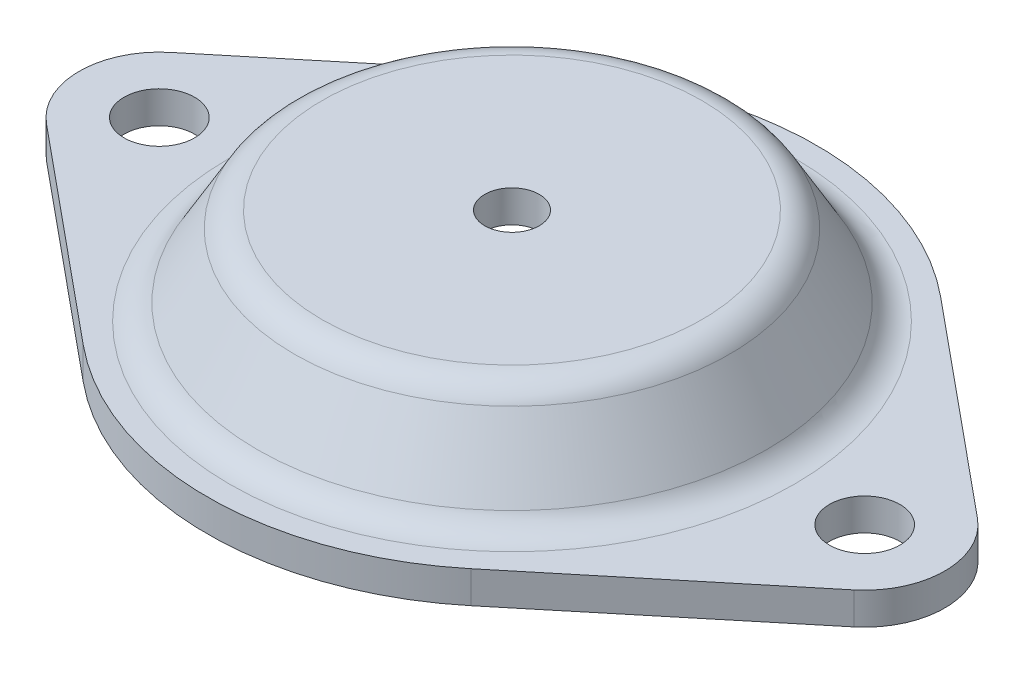
ISO-10303-21;
HEADER;
FILE_DESCRIPTION(('STEP AP214'),'2;1');
FILE_NAME('part.step','',(''),(''),'','','');
FILE_SCHEMA(('AUTOMOTIVE_DESIGN { 1 0 10303 214 1 1 1 1 }'));
ENDSEC;
DATA;
#1=APPLICATION_CONTEXT('core data for automotive mechanical design processes');
#2=APPLICATION_PROTOCOL_DEFINITION('international standard','automotive_design',2000,#1);
#3=PRODUCT_CONTEXT('',#1,'mechanical');
#4=PRODUCT('Part','Part','',(#3));
#5=PRODUCT_RELATED_PRODUCT_CATEGORY('part','',(#4));
#6=PRODUCT_DEFINITION_FORMATION('','',#4);
#7=PRODUCT_DEFINITION_CONTEXT('part definition',#1,'design');
#8=PRODUCT_DEFINITION('design','',#6,#7);
#9=PRODUCT_DEFINITION_SHAPE('','',#8);
#10=(LENGTH_UNIT() NAMED_UNIT(*) SI_UNIT(.MILLI.,.METRE.));
#11=(NAMED_UNIT(*) PLANE_ANGLE_UNIT() SI_UNIT($,.RADIAN.));
#12=(NAMED_UNIT(*) SI_UNIT($,.STERADIAN.) SOLID_ANGLE_UNIT());
#13=UNCERTAINTY_MEASURE_WITH_UNIT(LENGTH_MEASURE(1.E-05),#10,'distance_accuracy_value','');
#14=(GEOMETRIC_REPRESENTATION_CONTEXT(3) GLOBAL_UNCERTAINTY_ASSIGNED_CONTEXT((#13)) GLOBAL_UNIT_ASSIGNED_CONTEXT((#10,
#11,#12)) REPRESENTATION_CONTEXT('',''));
#15=CARTESIAN_POINT('',(0.,0.,0.));
#16=DIRECTION('',(0.,0.,1.));
#17=DIRECTION('',(1.,0.,0.));
#18=AXIS2_PLACEMENT_3D('',#15,#16,#17);
#19=CARTESIAN_POINT('',(-41.1602540378443,-15.,0.));
#20=DIRECTION('',(0.,1.,0.));
#21=DIRECTION('',(0.,0.,1.));
#22=AXIS2_PLACEMENT_3D('',#19,#20,#21);
#23=PLANE('',#22);
#24=CARTESIAN_POINT('',(55.,-15.,0.));
#25=DIRECTION('',(0.,1.,0.));
#26=DIRECTION('',(0.,0.,1.));
#27=AXIS2_PLACEMENT_3D('',#24,#25,#26);
#28=CIRCLE('',#27,5.5);
#29=CARTESIAN_POINT('',(55.,-15.,5.5));
#30=VERTEX_POINT('',#29);
#31=EDGE_CURVE('E176',#30,#30,#28,.T.);
#32=ORIENTED_EDGE('',*,*,#31,.F.);
#33=EDGE_LOOP('',(#32));
#34=FACE_BOUND('',#33,.T.);
#35=CARTESIAN_POINT('',(-55.,-15.,0.));
#36=DIRECTION('',(0.,1.,0.));
#37=DIRECTION('',(0.,0.,1.));
#38=AXIS2_PLACEMENT_3D('',#35,#36,#37);
#39=CIRCLE('',#38,5.5);
#40=CARTESIAN_POINT('',(-55.,-15.,5.5));
#41=VERTEX_POINT('',#40);
#42=EDGE_CURVE('E182',#41,#41,#39,.T.);
#43=ORIENTED_EDGE('',*,*,#42,.F.);
#44=EDGE_LOOP('',(#43));
#45=FACE_BOUND('',#44,.T.);
#46=CARTESIAN_POINT('',(0.,-15.,0.));
#47=DIRECTION('',(0.,1.,0.));
#48=DIRECTION('',(0.,0.,1.));
#49=AXIS2_PLACEMENT_3D('',#46,#47,#48);
#50=CIRCLE('',#49,44.0470053837925);
#51=CARTESIAN_POINT('',(0.,-15.,44.0470053837925));
#52=VERTEX_POINT('',#51);
#53=EDGE_CURVE('E203',#52,#52,#50,.F.);
#54=ORIENTED_EDGE('',*,*,#53,.T.);
#55=EDGE_LOOP('',(#54));
#56=FACE_BOUND('',#55,.T.);
#57=CARTESIAN_POINT('',(0.,-15.,0.));
#58=DIRECTION('',(0.,1.,0.));
#59=DIRECTION('',(0.,0.,1.));
#60=AXIS2_PLACEMENT_3D('',#57,#58,#59);
#61=CIRCLE('',#60,47.5);
#62=CARTESIAN_POINT('',(-30.2272727272727,-15.,36.6409877523938));
#63=VERTEX_POINT('',#62);
#64=CARTESIAN_POINT('',(30.2272727272727,-15.,36.6409877523938));
#65=VERTEX_POINT('',#64);
#66=EDGE_CURVE('E161',#63,#65,#61,.T.);
#67=ORIENTED_EDGE('',*,*,#66,.T.);
#68=DIRECTION('',(0.77138921583987,0.,-0.636363636363637));
#69=VECTOR('',#68,1.);
#70=CARTESIAN_POINT('',(5.73522073781167,-15.,56.8458998071355));
#71=LINE('',#70,#69);
#72=CARTESIAN_POINT('',(62.9545454545455,-15.,9.64236519799837));
#73=VERTEX_POINT('',#72);
#74=EDGE_CURVE('E164',#65,#73,#71,.T.);
#75=ORIENTED_EDGE('',*,*,#74,.T.);
#76=CARTESIAN_POINT('',(55.,-15.,0.));
#77=DIRECTION('',(0.,1.,0.));
#78=DIRECTION('',(0.,0.,1.));
#79=AXIS2_PLACEMENT_3D('',#76,#77,#78);
#80=CIRCLE('',#79,12.5);
#81=CARTESIAN_POINT('',(62.9545454545455,-15.,-9.64236519799837));
#82=VERTEX_POINT('',#81);
#83=EDGE_CURVE('E167',#73,#82,#80,.T.);
#84=ORIENTED_EDGE('',*,*,#83,.T.);
#85=DIRECTION('',(-0.77138921583987,0.,-0.636363636363637));
#86=VECTOR('',#85,1.);
#87=CARTESIAN_POINT('',(5.73522073781167,-15.,-56.8458998071355));
#88=LINE('',#87,#86);
#89=CARTESIAN_POINT('',(30.2272727272727,-15.,-36.6409877523938));
#90=VERTEX_POINT('',#89);
#91=EDGE_CURVE('E138',#82,#90,#88,.T.);
#92=ORIENTED_EDGE('',*,*,#91,.T.);
#93=CARTESIAN_POINT('',(0.,-15.,0.));
#94=DIRECTION('',(0.,1.,0.));
#95=DIRECTION('',(0.,0.,1.));
#96=AXIS2_PLACEMENT_3D('',#93,#94,#95);
#97=CIRCLE('',#96,47.5);
#98=CARTESIAN_POINT('',(-30.2272727272727,-15.,-36.6409877523938));
#99=VERTEX_POINT('',#98);
#100=EDGE_CURVE('E153',#90,#99,#97,.T.);
#101=ORIENTED_EDGE('',*,*,#100,.T.);
#102=DIRECTION('',(-0.77138921583987,0.,0.636363636363636));
#103=VECTOR('',#102,1.);
#104=CARTESIAN_POINT('',(-54.7193247167338,-15.,-16.4360756976522));
#105=LINE('',#104,#103);
#106=CARTESIAN_POINT('',(-62.9545454545455,-15.,-9.64236519799837));
#107=VERTEX_POINT('',#106);
#108=EDGE_CURVE('E108',#99,#107,#105,.T.);
#109=ORIENTED_EDGE('',*,*,#108,.T.);
#110=CARTESIAN_POINT('',(-55.,-15.,0.));
#111=DIRECTION('',(0.,1.,0.));
#112=DIRECTION('',(0.,0.,1.));
#113=AXIS2_PLACEMENT_3D('',#110,#111,#112);
#114=CIRCLE('',#113,12.5);
#115=CARTESIAN_POINT('',(-62.9545454545455,-15.,9.64236519799836));
#116=VERTEX_POINT('',#115);
#117=EDGE_CURVE('E156',#107,#116,#114,.T.);
#118=ORIENTED_EDGE('',*,*,#117,.T.);
#119=DIRECTION('',(0.77138921583987,0.,0.636363636363637));
#120=VECTOR('',#119,1.);
#121=CARTESIAN_POINT('',(-54.7193247167338,-15.,16.4360756976522));
#122=LINE('',#121,#120);
#123=EDGE_CURVE('E158',#116,#63,#122,.T.);
#124=ORIENTED_EDGE('',*,*,#123,.T.);
#125=EDGE_LOOP('',(#67,#75,#84,#92,#101,#109,#118,#124));
#126=FACE_BOUND('',#125,.T.);
#127=ADVANCED_FACE('F37',(#34,#45,#56,#126),#23,.T.);
#128=CARTESIAN_POINT('',(-67.5,-20.,0.));
#129=DIRECTION('',(0.,-1.,0.));
#130=DIRECTION('',(0.,0.,-1.));
#131=AXIS2_PLACEMENT_3D('',#128,#129,#130);
#132=PLANE('',#131);
#133=CARTESIAN_POINT('',(55.,-20.,0.));
#134=DIRECTION('',(0.,1.,0.));
#135=DIRECTION('',(0.,0.,1.));
#136=AXIS2_PLACEMENT_3D('',#133,#134,#135);
#137=CIRCLE('',#136,5.5);
#138=CARTESIAN_POINT('',(55.,-20.,5.5));
#139=VERTEX_POINT('',#138);
#140=EDGE_CURVE('E173',#139,#139,#137,.T.);
#141=ORIENTED_EDGE('',*,*,#140,.T.);
#142=EDGE_LOOP('',(#141));
#143=FACE_BOUND('',#142,.T.);
#144=CARTESIAN_POINT('',(-55.,-20.,0.));
#145=DIRECTION('',(0.,1.,0.));
#146=DIRECTION('',(0.,0.,1.));
#147=AXIS2_PLACEMENT_3D('',#144,#145,#146);
#148=CIRCLE('',#147,5.5);
#149=CARTESIAN_POINT('',(-55.,-20.,5.5));
#150=VERTEX_POINT('',#149);
#151=EDGE_CURVE('E179',#150,#150,#148,.T.);
#152=ORIENTED_EDGE('',*,*,#151,.T.);
#153=EDGE_LOOP('',(#152));
#154=FACE_BOUND('',#153,.T.);
#155=CARTESIAN_POINT('',(0.,-20.,0.));
#156=DIRECTION('',(0.,-1.,0.));
#157=DIRECTION('',(0.,0.,-1.));
#158=AXIS2_PLACEMENT_3D('',#155,#156,#157);
#159=CIRCLE('',#158,41.1602540378443);
#160=CARTESIAN_POINT('',(0.,-20.,-41.1602540378443));
#161=VERTEX_POINT('',#160);
#162=EDGE_CURVE('E185',#161,#161,#159,.F.);
#163=ORIENTED_EDGE('',*,*,#162,.T.);
#164=EDGE_LOOP('',(#163));
#165=FACE_BOUND('',#164,.T.);
#166=DIRECTION('',(-0.77138921583987,0.,-0.636363636363636));
#167=VECTOR('',#166,1.);
#168=CARTESIAN_POINT('',(62.9545454545455,-20.,-9.64236519799837));
#169=LINE('',#168,#167);
#170=CARTESIAN_POINT('',(62.9545454545455,-20.,-9.64236519799835));
#171=VERTEX_POINT('',#170);
#172=CARTESIAN_POINT('',(30.2272727272727,-20.,-36.6409877523938));
#173=VERTEX_POINT('',#172);
#174=EDGE_CURVE('E118',#171,#173,#169,.T.);
#175=ORIENTED_EDGE('',*,*,#174,.F.);
#176=CARTESIAN_POINT('',(55.,-20.,0.));
#177=DIRECTION('',(0.,-1.,0.));
#178=DIRECTION('',(0.,0.,-1.));
#179=AXIS2_PLACEMENT_3D('',#176,#177,#178);
#180=CIRCLE('',#179,12.5);
#181=CARTESIAN_POINT('',(62.9545454545455,-20.,9.64236519799837));
#182=VERTEX_POINT('',#181);
#183=EDGE_CURVE('E12',#171,#182,#180,.T.);
#184=ORIENTED_EDGE('',*,*,#183,.T.);
#185=DIRECTION('',(0.77138921583987,0.,-0.636363636363636));
#186=VECTOR('',#185,1.);
#187=CARTESIAN_POINT('',(62.9545454545455,-20.,9.64236519799837));
#188=LINE('',#187,#186);
#189=CARTESIAN_POINT('',(30.2272727272727,-20.,36.6409877523938));
#190=VERTEX_POINT('',#189);
#191=EDGE_CURVE('E132',#190,#182,#188,.T.);
#192=ORIENTED_EDGE('',*,*,#191,.F.);
#193=CARTESIAN_POINT('',(0.,-20.,0.));
#194=DIRECTION('',(0.,1.,0.));
#195=DIRECTION('',(0.,0.,1.));
#196=AXIS2_PLACEMENT_3D('',#193,#194,#195);
#197=CIRCLE('',#196,47.5);
#198=CARTESIAN_POINT('',(-30.2272727272727,-20.,36.6409877523938));
#199=VERTEX_POINT('',#198);
#200=EDGE_CURVE('E126',#199,#190,#197,.T.);
#201=ORIENTED_EDGE('',*,*,#200,.F.);
#202=DIRECTION('',(0.77138921583987,0.,0.636363636363636));
#203=VECTOR('',#202,1.);
#204=CARTESIAN_POINT('',(-62.9545454545455,-20.,9.64236519799837));
#205=LINE('',#204,#203);
#206=CARTESIAN_POINT('',(-62.9545454545455,-20.,9.64236519799836));
#207=VERTEX_POINT('',#206);
#208=EDGE_CURVE('E123',#207,#199,#205,.T.);
#209=ORIENTED_EDGE('',*,*,#208,.F.);
#210=CARTESIAN_POINT('',(-55.,-20.,0.));
#211=DIRECTION('',(0.,-1.,0.));
#212=DIRECTION('',(0.,0.,-1.));
#213=AXIS2_PLACEMENT_3D('',#210,#211,#212);
#214=CIRCLE('',#213,12.5);
#215=CARTESIAN_POINT('',(-62.9545454545455,-20.,-9.64236519799837));
#216=VERTEX_POINT('',#215);
#217=EDGE_CURVE('E45',#207,#216,#214,.T.);
#218=ORIENTED_EDGE('',*,*,#217,.T.);
#219=DIRECTION('',(-0.77138921583987,0.,0.636363636363636));
#220=VECTOR('',#219,1.);
#221=CARTESIAN_POINT('',(-62.9545454545455,-20.,-9.64236519799837));
#222=LINE('',#221,#220);
#223=CARTESIAN_POINT('',(-30.2272727272727,-20.,-36.6409877523938));
#224=VERTEX_POINT('',#223);
#225=EDGE_CURVE('E106',#224,#216,#222,.T.);
#226=ORIENTED_EDGE('',*,*,#225,.F.);
#227=CARTESIAN_POINT('',(0.,-20.,0.));
#228=DIRECTION('',(0.,1.,0.));
#229=DIRECTION('',(0.,0.,1.));
#230=AXIS2_PLACEMENT_3D('',#227,#228,#229);
#231=CIRCLE('',#230,47.5);
#232=EDGE_CURVE('E114',#173,#224,#231,.T.);
#233=ORIENTED_EDGE('',*,*,#232,.F.);
#234=EDGE_LOOP('',(#175,#184,#192,#201,#209,#218,#226,#233));
#235=FACE_BOUND('',#234,.T.);
#236=ADVANCED_FACE('F120',(#143,#154,#165,#235),#132,.T.);
#237=CARTESIAN_POINT('',(0.,0.,0.));
#238=DIRECTION('',(0.,1.,0.));
#239=DIRECTION('',(0.,0.,1.));
#240=AXIS2_PLACEMENT_3D('',#237,#238,#239);
#241=PLANE('',#240);
#242=CARTESIAN_POINT('',(0.,0.,0.));
#243=DIRECTION('',(0.,1.,0.));
#244=DIRECTION('',(0.,0.,1.));
#245=AXIS2_PLACEMENT_3D('',#242,#243,#244);
#246=CIRCLE('',#245,4.24999999999999);
#247=CARTESIAN_POINT('',(0.,0.,4.24999999999999));
#248=VERTEX_POINT('',#247);
#249=EDGE_CURVE('E169',#248,#248,#246,.T.);
#250=ORIENTED_EDGE('',*,*,#249,.F.);
#251=EDGE_LOOP('',(#250));
#252=FACE_BOUND('',#251,.T.);
#253=CARTESIAN_POINT('',(0.,0.,0.));
#254=DIRECTION('',(0.,1.,0.));
#255=DIRECTION('',(0.,0.,1.));
#256=AXIS2_PLACEMENT_3D('',#253,#254,#255);
#257=CIRCLE('',#256,29.6132486540518);
#258=CARTESIAN_POINT('',(0.,0.,29.6132486540518));
#259=VERTEX_POINT('',#258);
#260=EDGE_CURVE('E206',#259,#259,#257,.T.);
#261=ORIENTED_EDGE('',*,*,#260,.T.);
#262=EDGE_LOOP('',(#261));
#263=FACE_BOUND('',#262,.T.);
#264=ADVANCED_FACE('F237',(#252,#263),#241,.T.);
#265=CARTESIAN_POINT('',(0.,0.,0.));
#266=DIRECTION('',(0.,-1.,0.));
#267=DIRECTION('',(0.,0.,-1.));
#268=AXIS2_PLACEMENT_3D('',#265,#266,#267);
#269=CONICAL_SURFACE('',#268,32.5,0.523598775598296);
#270=CARTESIAN_POINT('',(0.,-12.5,0.));
#271=DIRECTION('',(0.,-1.,0.));
#272=DIRECTION('',(0.,0.,-1.));
#273=AXIS2_PLACEMENT_3D('',#270,#271,#272);
#274=CIRCLE('',#273,39.7168783648703);
#275=CARTESIAN_POINT('',(0.,-12.5,-39.7168783648703));
#276=VERTEX_POINT('',#275);
#277=EDGE_CURVE('E200',#276,#276,#274,.F.);
#278=ORIENTED_EDGE('',*,*,#277,.T.);
#279=EDGE_LOOP('',(#278));
#280=FACE_BOUND('',#279,.T.);
#281=CARTESIAN_POINT('',(0.,-2.50000000000002,0.));
#282=DIRECTION('',(0.,1.,0.));
#283=DIRECTION('',(0.,0.,1.));
#284=AXIS2_PLACEMENT_3D('',#281,#282,#283);
#285=CIRCLE('',#284,33.9433756729741);
#286=CARTESIAN_POINT('',(0.,-2.50000000000002,33.9433756729741));
#287=VERTEX_POINT('',#286);
#288=EDGE_CURVE('E197',#287,#287,#285,.F.);
#289=ORIENTED_EDGE('',*,*,#288,.T.);
#290=EDGE_LOOP('',(#289));
#291=FACE_BOUND('',#290,.T.);
#292=ADVANCED_FACE('F231',(#280,#291),#269,.T.);
#293=CARTESIAN_POINT('',(0.,-20.,0.));
#294=DIRECTION('',(0.,-1.,0.));
#295=DIRECTION('',(0.,0.,-1.));
#296=AXIS2_PLACEMENT_3D('',#293,#294,#295);
#297=CONICAL_SURFACE('',#296,38.2735026918962,0.523598775598296);
#298=CARTESIAN_POINT('',(0.,-17.5,0.));
#299=DIRECTION('',(0.,1.,0.));
#300=DIRECTION('',(0.,0.,1.));
#301=AXIS2_PLACEMENT_3D('',#298,#299,#300);
#302=CIRCLE('',#301,36.8301270189221);
#303=CARTESIAN_POINT('',(0.,-17.5,36.8301270189221));
#304=VERTEX_POINT('',#303);
#305=EDGE_CURVE('E191',#304,#304,#302,.F.);
#306=ORIENTED_EDGE('',*,*,#305,.T.);
#307=EDGE_LOOP('',(#306));
#308=FACE_BOUND('',#307,.T.);
#309=CARTESIAN_POINT('',(0.,-7.50000000000002,0.));
#310=DIRECTION('',(0.,-1.,0.));
#311=DIRECTION('',(0.,0.,-1.));
#312=AXIS2_PLACEMENT_3D('',#309,#310,#311);
#313=CIRCLE('',#312,31.0566243270259);
#314=CARTESIAN_POINT('',(0.,-7.50000000000002,-31.0566243270259));
#315=VERTEX_POINT('',#314);
#316=EDGE_CURVE('E188',#315,#315,#313,.F.);
#317=ORIENTED_EDGE('',*,*,#316,.T.);
#318=EDGE_LOOP('',(#317));
#319=FACE_BOUND('',#318,.T.);
#320=ADVANCED_FACE('F219',(#308,#319),#297,.F.);
#321=CARTESIAN_POINT('',(-29.6132486540518,-5.,0.));
#322=DIRECTION('',(0.,-1.,0.));
#323=DIRECTION('',(0.,0.,-1.));
#324=AXIS2_PLACEMENT_3D('',#321,#322,#323);
#325=PLANE('',#324);
#326=CARTESIAN_POINT('',(0.,-5.,0.));
#327=DIRECTION('',(0.,-1.,0.));
#328=DIRECTION('',(0.,0.,-1.));
#329=AXIS2_PLACEMENT_3D('',#326,#327,#328);
#330=CIRCLE('',#329,4.24999999999999);
#331=CARTESIAN_POINT('',(0.,-5.,-4.24999999999999));
#332=VERTEX_POINT('',#331);
#333=EDGE_CURVE('E172',#332,#332,#330,.T.);
#334=ORIENTED_EDGE('',*,*,#333,.F.);
#335=EDGE_LOOP('',(#334));
#336=FACE_BOUND('',#335,.T.);
#337=CARTESIAN_POINT('',(0.,-5.,0.));
#338=DIRECTION('',(0.,-1.,0.));
#339=DIRECTION('',(0.,0.,-1.));
#340=AXIS2_PLACEMENT_3D('',#337,#338,#339);
#341=CIRCLE('',#340,26.7264973081037);
#342=CARTESIAN_POINT('',(0.,-5.,-26.7264973081037));
#343=VERTEX_POINT('',#342);
#344=EDGE_CURVE('E194',#343,#343,#341,.T.);
#345=ORIENTED_EDGE('',*,*,#344,.T.);
#346=EDGE_LOOP('',(#345));
#347=FACE_BOUND('',#346,.T.);
#348=ADVANCED_FACE('F215',(#336,#347),#325,.T.);
#349=CARTESIAN_POINT('',(0.,-15.,0.));
#350=DIRECTION('',(0.,-1.,0.));
#351=DIRECTION('',(0.,0.,-1.));
#352=AXIS2_PLACEMENT_3D('',#349,#350,#351);
#353=TOROIDAL_SURFACE('',#352,41.1602540378443,5.);
#354=ORIENTED_EDGE('',*,*,#305,.F.);
#355=EDGE_LOOP('',(#354));
#356=FACE_BOUND('',#355,.T.);
#357=ORIENTED_EDGE('',*,*,#162,.F.);
#358=EDGE_LOOP('',(#357));
#359=FACE_BOUND('',#358,.T.);
#360=ADVANCED_FACE('F218',(#356,#359),#353,.T.);
#361=CARTESIAN_POINT('',(0.,-10.,0.));
#362=DIRECTION('',(0.,-1.,0.));
#363=DIRECTION('',(0.,0.,-1.));
#364=AXIS2_PLACEMENT_3D('',#361,#362,#363);
#365=TOROIDAL_SURFACE('',#364,26.7264973081037,5.);
#366=ORIENTED_EDGE('',*,*,#344,.F.);
#367=EDGE_LOOP('',(#366));
#368=FACE_BOUND('',#367,.T.);
#369=ORIENTED_EDGE('',*,*,#316,.F.);
#370=EDGE_LOOP('',(#369));
#371=FACE_BOUND('',#370,.T.);
#372=ADVANCED_FACE('F223',(#368,#371),#365,.F.);
#373=CARTESIAN_POINT('',(0.,-10.,0.));
#374=DIRECTION('',(0.,1.,0.));
#375=DIRECTION('',(0.,0.,1.));
#376=AXIS2_PLACEMENT_3D('',#373,#374,#375);
#377=TOROIDAL_SURFACE('',#376,44.0470053837925,5.);
#378=ORIENTED_EDGE('',*,*,#53,.F.);
#379=EDGE_LOOP('',(#378));
#380=FACE_BOUND('',#379,.T.);
#381=ORIENTED_EDGE('',*,*,#277,.F.);
#382=EDGE_LOOP('',(#381));
#383=FACE_BOUND('',#382,.T.);
#384=ADVANCED_FACE('F226',(#380,#383),#377,.F.);
#385=CARTESIAN_POINT('',(0.,-5.,0.));
#386=DIRECTION('',(0.,1.,0.));
#387=DIRECTION('',(0.,0.,1.));
#388=AXIS2_PLACEMENT_3D('',#385,#386,#387);
#389=TOROIDAL_SURFACE('',#388,29.6132486540518,5.);
#390=ORIENTED_EDGE('',*,*,#288,.F.);
#391=EDGE_LOOP('',(#390));
#392=FACE_BOUND('',#391,.T.);
#393=ORIENTED_EDGE('',*,*,#260,.F.);
#394=EDGE_LOOP('',(#393));
#395=FACE_BOUND('',#394,.T.);
#396=ADVANCED_FACE('F39',(#392,#395),#389,.T.);
#397=CARTESIAN_POINT('',(-55.,-20.,0.));
#398=DIRECTION('',(0.,1.,0.));
#399=DIRECTION('',(0.,0.,1.));
#400=AXIS2_PLACEMENT_3D('',#397,#398,#399);
#401=CYLINDRICAL_SURFACE('',#400,5.5);
#402=ORIENTED_EDGE('',*,*,#42,.T.);
#403=EDGE_LOOP('',(#402));
#404=FACE_BOUND('',#403,.T.);
#405=ORIENTED_EDGE('',*,*,#151,.F.);
#406=EDGE_LOOP('',(#405));
#407=FACE_BOUND('',#406,.T.);
#408=ADVANCED_FACE('F261',(#404,#407),#401,.F.);
#409=CARTESIAN_POINT('',(55.,-20.,0.));
#410=DIRECTION('',(0.,1.,0.));
#411=DIRECTION('',(0.,0.,1.));
#412=AXIS2_PLACEMENT_3D('',#409,#410,#411);
#413=CYLINDRICAL_SURFACE('',#412,5.5);
#414=ORIENTED_EDGE('',*,*,#31,.T.);
#415=EDGE_LOOP('',(#414));
#416=FACE_BOUND('',#415,.T.);
#417=ORIENTED_EDGE('',*,*,#140,.F.);
#418=EDGE_LOOP('',(#417));
#419=FACE_BOUND('',#418,.T.);
#420=ADVANCED_FACE('F300',(#416,#419),#413,.F.);
#421=CARTESIAN_POINT('',(0.,0.,0.));
#422=DIRECTION('',(0.,1.,0.));
#423=DIRECTION('',(0.,0.,1.));
#424=AXIS2_PLACEMENT_3D('',#421,#422,#423);
#425=CYLINDRICAL_SURFACE('',#424,4.24999999999999);
#426=ORIENTED_EDGE('',*,*,#333,.T.);
#427=EDGE_LOOP('',(#426));
#428=FACE_BOUND('',#427,.T.);
#429=ORIENTED_EDGE('',*,*,#249,.T.);
#430=EDGE_LOOP('',(#429));
#431=FACE_BOUND('',#430,.T.);
#432=ADVANCED_FACE('F212',(#428,#431),#425,.F.);
#433=CARTESIAN_POINT('',(55.,-20.,0.));
#434=DIRECTION('',(0.,1.,0.));
#435=DIRECTION('',(0.,0.,1.));
#436=AXIS2_PLACEMENT_3D('',#433,#434,#435);
#437=CYLINDRICAL_SURFACE('',#436,12.5);
#438=DIRECTION('',(0.,1.,0.));
#439=VECTOR('',#438,1.);
#440=CARTESIAN_POINT('',(62.9545454545455,-20.,9.64236519799837));
#441=LINE('',#440,#439);
#442=EDGE_CURVE('E135',#182,#73,#441,.T.);
#443=ORIENTED_EDGE('',*,*,#442,.F.);
#444=ORIENTED_EDGE('',*,*,#183,.F.);
#445=DIRECTION('',(0.,1.,0.));
#446=VECTOR('',#445,1.);
#447=CARTESIAN_POINT('',(62.9545454545455,-20.,-9.64236519799837));
#448=LINE('',#447,#446);
#449=EDGE_CURVE('E57',#171,#82,#448,.T.);
#450=ORIENTED_EDGE('',*,*,#449,.T.);
#451=ORIENTED_EDGE('',*,*,#83,.F.);
#452=EDGE_LOOP('',(#443,#444,#450,#451));
#453=FACE_BOUND('',#452,.T.);
#454=ADVANCED_FACE('F285',(#453),#437,.T.);
#455=CARTESIAN_POINT('',(-55.,-20.,0.));
#456=DIRECTION('',(0.,1.,0.));
#457=DIRECTION('',(0.,0.,1.));
#458=AXIS2_PLACEMENT_3D('',#455,#456,#457);
#459=CYLINDRICAL_SURFACE('',#458,12.5);
#460=DIRECTION('',(0.,1.,0.));
#461=VECTOR('',#460,1.);
#462=CARTESIAN_POINT('',(-62.9545454545455,-20.,-9.64236519799837));
#463=LINE('',#462,#461);
#464=EDGE_CURVE('E111',#216,#107,#463,.T.);
#465=ORIENTED_EDGE('',*,*,#464,.F.);
#466=ORIENTED_EDGE('',*,*,#217,.F.);
#467=DIRECTION('',(0.,1.,0.));
#468=VECTOR('',#467,1.);
#469=CARTESIAN_POINT('',(-62.9545454545455,-20.,9.64236519799836));
#470=LINE('',#469,#468);
#471=EDGE_CURVE('E145',#207,#116,#470,.T.);
#472=ORIENTED_EDGE('',*,*,#471,.T.);
#473=ORIENTED_EDGE('',*,*,#117,.F.);
#474=EDGE_LOOP('',(#465,#466,#472,#473));
#475=FACE_BOUND('',#474,.T.);
#476=ADVANCED_FACE('F297',(#475),#459,.T.);
#477=CARTESIAN_POINT('',(62.9545454545455,-20.,9.64236519799837));
#478=DIRECTION('',(0.636363636363637,0.,0.77138921583987));
#479=DIRECTION('',(0.77138921583987,0.,-0.636363636363637));
#480=AXIS2_PLACEMENT_3D('',#477,#478,#479);
#481=PLANE('',#480);
#482=DIRECTION('',(0.,1.,0.));
#483=VECTOR('',#482,1.);
#484=CARTESIAN_POINT('',(30.2272727272727,-20.,36.6409877523938));
#485=LINE('',#484,#483);
#486=EDGE_CURVE('E139',#190,#65,#485,.T.);
#487=ORIENTED_EDGE('',*,*,#486,.F.);
#488=ORIENTED_EDGE('',*,*,#191,.T.);
#489=ORIENTED_EDGE('',*,*,#442,.T.);
#490=ORIENTED_EDGE('',*,*,#74,.F.);
#491=EDGE_LOOP('',(#487,#488,#489,#490));
#492=FACE_BOUND('',#491,.T.);
#493=ADVANCED_FACE('F283',(#492),#481,.T.);
#494=CARTESIAN_POINT('',(0.,-20.,0.));
#495=DIRECTION('',(0.,1.,0.));
#496=DIRECTION('',(0.,0.,1.));
#497=AXIS2_PLACEMENT_3D('',#494,#495,#496);
#498=CYLINDRICAL_SURFACE('',#497,47.5);
#499=DIRECTION('',(0.,1.,0.));
#500=VECTOR('',#499,1.);
#501=CARTESIAN_POINT('',(-30.2272727272727,-20.,36.6409877523938));
#502=LINE('',#501,#500);
#503=EDGE_CURVE('E142',#199,#63,#502,.T.);
#504=ORIENTED_EDGE('',*,*,#503,.F.);
#505=ORIENTED_EDGE('',*,*,#200,.T.);
#506=ORIENTED_EDGE('',*,*,#486,.T.);
#507=ORIENTED_EDGE('',*,*,#66,.F.);
#508=EDGE_LOOP('',(#504,#505,#506,#507));
#509=FACE_BOUND('',#508,.T.);
#510=ADVANCED_FACE('F275',(#509),#498,.T.);
#511=CARTESIAN_POINT('',(-62.9545454545455,-20.,9.64236519799837));
#512=DIRECTION('',(-0.636363636363637,0.,0.77138921583987));
#513=DIRECTION('',(0.77138921583987,0.,0.636363636363637));
#514=AXIS2_PLACEMENT_3D('',#511,#512,#513);
#515=PLANE('',#514);
#516=ORIENTED_EDGE('',*,*,#471,.F.);
#517=ORIENTED_EDGE('',*,*,#208,.T.);
#518=ORIENTED_EDGE('',*,*,#503,.T.);
#519=ORIENTED_EDGE('',*,*,#123,.F.);
#520=EDGE_LOOP('',(#516,#517,#518,#519));
#521=FACE_BOUND('',#520,.T.);
#522=ADVANCED_FACE('F278',(#521),#515,.T.);
#523=CARTESIAN_POINT('',(-62.9545454545455,-20.,-9.64236519799837));
#524=DIRECTION('',(-0.636363636363636,0.,-0.77138921583987));
#525=DIRECTION('',(-0.77138921583987,0.,0.636363636363636));
#526=AXIS2_PLACEMENT_3D('',#523,#524,#525);
#527=PLANE('',#526);
#528=DIRECTION('',(0.,1.,0.));
#529=VECTOR('',#528,1.);
#530=CARTESIAN_POINT('',(-30.2272727272727,-20.,-36.6409877523938));
#531=LINE('',#530,#529);
#532=EDGE_CURVE('E101',#224,#99,#531,.T.);
#533=ORIENTED_EDGE('',*,*,#532,.F.);
#534=ORIENTED_EDGE('',*,*,#225,.T.);
#535=ORIENTED_EDGE('',*,*,#464,.T.);
#536=ORIENTED_EDGE('',*,*,#108,.F.);
#537=EDGE_LOOP('',(#533,#534,#535,#536));
#538=FACE_BOUND('',#537,.T.);
#539=ADVANCED_FACE('F103',(#538),#527,.T.);
#540=CARTESIAN_POINT('',(0.,-20.,0.));
#541=DIRECTION('',(0.,1.,0.));
#542=DIRECTION('',(0.,0.,1.));
#543=AXIS2_PLACEMENT_3D('',#540,#541,#542);
#544=CYLINDRICAL_SURFACE('',#543,47.5);
#545=DIRECTION('',(0.,1.,0.));
#546=VECTOR('',#545,1.);
#547=CARTESIAN_POINT('',(30.2272727272727,-20.,-36.6409877523938));
#548=LINE('',#547,#546);
#549=EDGE_CURVE('E52',#173,#90,#548,.T.);
#550=ORIENTED_EDGE('',*,*,#549,.F.);
#551=ORIENTED_EDGE('',*,*,#232,.T.);
#552=ORIENTED_EDGE('',*,*,#532,.T.);
#553=ORIENTED_EDGE('',*,*,#100,.F.);
#554=EDGE_LOOP('',(#550,#551,#552,#553));
#555=FACE_BOUND('',#554,.T.);
#556=ADVANCED_FACE('F115',(#555),#544,.T.);
#557=CARTESIAN_POINT('',(62.9545454545455,-20.,-9.64236519799837));
#558=DIRECTION('',(0.636363636363637,0.,-0.77138921583987));
#559=DIRECTION('',(-0.77138921583987,0.,-0.636363636363637));
#560=AXIS2_PLACEMENT_3D('',#557,#558,#559);
#561=PLANE('',#560);
#562=ORIENTED_EDGE('',*,*,#449,.F.);
#563=ORIENTED_EDGE('',*,*,#174,.T.);
#564=ORIENTED_EDGE('',*,*,#549,.T.);
#565=ORIENTED_EDGE('',*,*,#91,.F.);
#566=EDGE_LOOP('',(#562,#563,#564,#565));
#567=FACE_BOUND('',#566,.T.);
#568=ADVANCED_FACE('F286',(#567),#561,.T.);
#569=CLOSED_SHELL('',(#127,#236,#264,#292,#320,#348,#360,#372,#384,#396,#408,#420,#432,#454,
#476,#493,#510,#522,#539,#556,#568));
#570=MANIFOLD_SOLID_BREP('B2',#569);
#571=ADVANCED_BREP_SHAPE_REPRESENTATION('',(#18,#570),#14);
#572=SHAPE_DEFINITION_REPRESENTATION(#9,#571);
ENDSEC;
END-ISO-10303-21;
